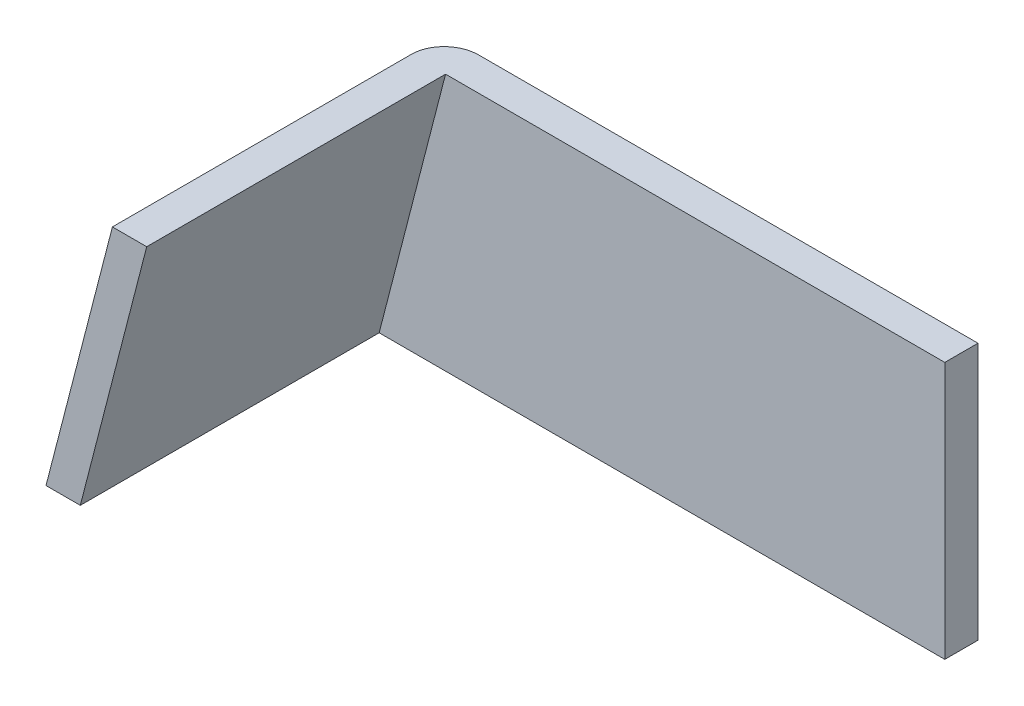
ISO-10303-21;
HEADER;
FILE_DESCRIPTION(('STEP AP214'),'2;1');
FILE_NAME('part.step','',(''),(''),'','','');
FILE_SCHEMA(('AUTOMOTIVE_DESIGN { 1 0 10303 214 1 1 1 1 }'));
ENDSEC;
DATA;
#1=APPLICATION_CONTEXT('core data for automotive mechanical design processes');
#2=APPLICATION_PROTOCOL_DEFINITION('international standard','automotive_design',2000,#1);
#3=PRODUCT_CONTEXT('',#1,'mechanical');
#4=PRODUCT('Part','Part','',(#3));
#5=PRODUCT_RELATED_PRODUCT_CATEGORY('part','',(#4));
#6=PRODUCT_DEFINITION_FORMATION('','',#4);
#7=PRODUCT_DEFINITION_CONTEXT('part definition',#1,'design');
#8=PRODUCT_DEFINITION('design','',#6,#7);
#9=PRODUCT_DEFINITION_SHAPE('','',#8);
#10=(LENGTH_UNIT() NAMED_UNIT(*) SI_UNIT(.MILLI.,.METRE.));
#11=(NAMED_UNIT(*) PLANE_ANGLE_UNIT() SI_UNIT($,.RADIAN.));
#12=(NAMED_UNIT(*) SI_UNIT($,.STERADIAN.) SOLID_ANGLE_UNIT());
#13=UNCERTAINTY_MEASURE_WITH_UNIT(LENGTH_MEASURE(1.E-05),#10,'distance_accuracy_value','');
#14=(GEOMETRIC_REPRESENTATION_CONTEXT(3) GLOBAL_UNCERTAINTY_ASSIGNED_CONTEXT((#13)) GLOBAL_UNIT_ASSIGNED_CONTEXT((#10,
#11,#12)) REPRESENTATION_CONTEXT('',''));
#15=CARTESIAN_POINT('',(0.,0.,0.));
#16=DIRECTION('',(0.,0.,1.));
#17=DIRECTION('',(1.,0.,0.));
#18=AXIS2_PLACEMENT_3D('',#15,#16,#17);
#19=CARTESIAN_POINT('',(-54.0821026600799,-24.5934553307693,-5.08));
#20=DIRECTION('',(0.249998310160621,0.968246272864933,0.));
#21=DIRECTION('',(-0.968246272864933,0.249998310160621,0.));
#22=AXIS2_PLACEMENT_3D('',#19,#20,#21);
#23=PLANE('',#22);
#24=DIRECTION('',(0.,0.,1.));
#25=VECTOR('',#24,1.);
#26=CARTESIAN_POINT('',(-54.0821026600799,-24.5934553307693,-5.08));
#27=LINE('',#26,#25);
#28=CARTESIAN_POINT('',(-54.0821026600799,-24.5934553307693,-3.19280790196288));
#29=VERTEX_POINT('',#28);
#30=CARTESIAN_POINT('',(-54.0821026600798,-24.5934553307693,-3.175));
#31=VERTEX_POINT('',#30);
#32=EDGE_CURVE('E72',#29,#31,#27,.T.);
#33=ORIENTED_EDGE('',*,*,#32,.F.);
#34=CARTESIAN_POINT('',(-54.0648117797553,-24.597919784683,0.));
#35=DIRECTION('',(0.249998310160621,0.968246272864933,0.));
#36=DIRECTION('',(0.701781311894938,-0.18119784913493,-0.688963228150744));
#37=AXIS2_PLACEMENT_3D('',#34,#35,#36);
#38=ELLIPSE('',#37,3.1928587254666,3.19285706304279);
#39=CARTESIAN_POINT('',(-57.156284576426,-23.7997106960093,0.));
#40=VERTEX_POINT('',#39);
#41=EDGE_CURVE('E47',#29,#40,#38,.T.);
#42=ORIENTED_EDGE('',*,*,#41,.T.);
#43=CARTESIAN_POINT('',(-54.0821026600798,-24.5934553307693,0.));
#44=DIRECTION('',(0.249998310160622,0.968246272864933,0.));
#45=DIRECTION('',(-0.968246272864933,0.249998310160622,0.));
#46=AXIS2_PLACEMENT_3D('',#43,#44,#45);
#47=CIRCLE('',#46,3.175);
#48=EDGE_CURVE('E147',#31,#40,#47,.T.);
#49=ORIENTED_EDGE('',*,*,#48,.F.);
#50=EDGE_LOOP('',(#33,#42,#49));
#51=FACE_BOUND('',#50,.T.);
#52=ADVANCED_FACE('F38',(#51),#23,.T.);
#53=CARTESIAN_POINT('',(-47.732145582,0.,-3.175));
#54=DIRECTION('',(0.,1.,0.));
#55=DIRECTION('',(0.,0.,1.));
#56=AXIS2_PLACEMENT_3D('',#53,#54,#55);
#57=PLANE('',#56);
#58=DIRECTION('',(-1.,0.,0.));
#59=VECTOR('',#58,1.);
#60=CARTESIAN_POINT('',(-47.732145582,0.,0.));
#61=LINE('',#60,#59);
#62=CARTESIAN_POINT('',(0.,0.,0.));
#63=VERTEX_POINT('',#62);
#64=CARTESIAN_POINT('',(-47.732145582,0.,0.));
#65=VERTEX_POINT('',#64);
#66=EDGE_CURVE('E160',#63,#65,#61,.T.);
#67=ORIENTED_EDGE('',*,*,#66,.F.);
#68=DIRECTION('',(0.,0.,1.));
#69=VECTOR('',#68,1.);
#70=CARTESIAN_POINT('',(0.,0.,-3.175));
#71=LINE('',#70,#69);
#72=CARTESIAN_POINT('',(0.,0.,-3.175));
#73=VERTEX_POINT('',#72);
#74=EDGE_CURVE('E55',#73,#63,#71,.T.);
#75=ORIENTED_EDGE('',*,*,#74,.F.);
#76=DIRECTION('',(-1.,0.,0.));
#77=VECTOR('',#76,1.);
#78=CARTESIAN_POINT('',(-47.732145582,0.,-3.175));
#79=LINE('',#78,#77);
#80=CARTESIAN_POINT('',(-47.732145582,0.,-3.175));
#81=VERTEX_POINT('',#80);
#82=EDGE_CURVE('E164',#73,#81,#79,.T.);
#83=ORIENTED_EDGE('',*,*,#82,.T.);
#84=CARTESIAN_POINT('',(-47.732145582,0.,0.));
#85=DIRECTION('',(0.,-1.,0.));
#86=DIRECTION('',(1.,0.,0.));
#87=AXIS2_PLACEMENT_3D('',#84,#85,#86);
#88=ELLIPSE('',#87,3.27912442214265,3.175);
#89=CARTESIAN_POINT('',(-51.0112700041428,0.,0.));
#90=VERTEX_POINT('',#89);
#91=EDGE_CURVE('E132',#81,#90,#88,.F.);
#92=ORIENTED_EDGE('',*,*,#91,.T.);
#93=DIRECTION('',(0.,0.,1.));
#94=VECTOR('',#93,1.);
#95=CARTESIAN_POINT('',(-51.0112700041428,0.,-5.588));
#96=LINE('',#95,#94);
#97=CARTESIAN_POINT('',(-51.0112700041428,0.,28.575));
#98=VERTEX_POINT('',#97);
#99=EDGE_CURVE('E125',#90,#98,#96,.T.);
#100=ORIENTED_EDGE('',*,*,#99,.T.);
#101=DIRECTION('',(-1.,0.,0.));
#102=VECTOR('',#101,1.);
#103=CARTESIAN_POINT('',(-50.8063274983463,0.,28.575));
#104=LINE('',#103,#102);
#105=CARTESIAN_POINT('',(-47.7321455820001,0.,28.575));
#106=VERTEX_POINT('',#105);
#107=EDGE_CURVE('E127',#106,#98,#104,.T.);
#108=ORIENTED_EDGE('',*,*,#107,.F.);
#109=DIRECTION('',(0.,0.,-1.));
#110=VECTOR('',#109,1.);
#111=CARTESIAN_POINT('',(-47.732145582,0.,0.));
#112=LINE('',#111,#110);
#113=EDGE_CURVE('E144',#106,#65,#112,.T.);
#114=ORIENTED_EDGE('',*,*,#113,.T.);
#115=EDGE_LOOP('',(#67,#75,#83,#92,#100,#108,#114));
#116=FACE_BOUND('',#115,.T.);
#117=ADVANCED_FACE('F202',(#116),#57,.T.);
#118=CARTESIAN_POINT('',(0.,-24.5934553307693,-3.175));
#119=DIRECTION('',(1.,0.,0.));
#120=DIRECTION('',(0.,0.,-1.));
#121=AXIS2_PLACEMENT_3D('',#118,#119,#120);
#122=PLANE('',#121);
#123=DIRECTION('',(0.,1.,0.));
#124=VECTOR('',#123,1.);
#125=CARTESIAN_POINT('',(0.,-24.5934553307693,0.));
#126=LINE('',#125,#124);
#127=CARTESIAN_POINT('',(0.,-24.5934553307693,0.));
#128=VERTEX_POINT('',#127);
#129=EDGE_CURVE('E170',#128,#63,#126,.T.);
#130=ORIENTED_EDGE('',*,*,#129,.F.);
#131=DIRECTION('',(0.,0.,1.));
#132=VECTOR('',#131,1.);
#133=CARTESIAN_POINT('',(0.,-24.5934553307693,-3.175));
#134=LINE('',#133,#132);
#135=CARTESIAN_POINT('',(0.,-24.5934553307693,-3.175));
#136=VERTEX_POINT('',#135);
#137=EDGE_CURVE('E66',#136,#128,#134,.T.);
#138=ORIENTED_EDGE('',*,*,#137,.F.);
#139=DIRECTION('',(0.,1.,0.));
#140=VECTOR('',#139,1.);
#141=CARTESIAN_POINT('',(0.,-24.5934553307693,-3.175));
#142=LINE('',#141,#140);
#143=EDGE_CURVE('E162',#136,#73,#142,.T.);
#144=ORIENTED_EDGE('',*,*,#143,.T.);
#145=ORIENTED_EDGE('',*,*,#74,.T.);
#146=EDGE_LOOP('',(#130,#138,#144,#145));
#147=FACE_BOUND('',#146,.T.);
#148=ADVANCED_FACE('F191',(#147),#122,.T.);
#149=CARTESIAN_POINT('',(-54.0821026600798,-24.5934553307693,-3.175));
#150=DIRECTION('',(0.,-1.,0.));
#151=DIRECTION('',(1.,0.,0.));
#152=AXIS2_PLACEMENT_3D('',#149,#150,#151);
#153=PLANE('',#152);
#154=DIRECTION('',(-0.999994464513361,0.,-0.00332730260657873));
#155=VECTOR('',#154,1.);
#156=CARTESIAN_POINT('',(-54.0927011661266,-24.5934553307693,0.0102971106335373));
#157=LINE('',#156,#155);
#158=CARTESIAN_POINT('',(-57.360600989923,-24.5934553307693,-0.000576241157511481));
#159=VERTEX_POINT('',#158);
#160=CARTESIAN_POINT('',(-57.3612270822224,-24.5934553307693,-0.000578324367583229));
#161=VERTEX_POINT('',#160);
#162=EDGE_CURVE('E117',#159,#161,#157,.T.);
#163=ORIENTED_EDGE('',*,*,#162,.F.);
#164=CARTESIAN_POINT('',(-54.063662592508,-24.5934553307693,3.24109539653924E-06));
#165=DIRECTION('',(0.,-1.,0.));
#166=DIRECTION('',(-0.999996022873098,0.,-0.00282032586542445));
#167=AXIS2_PLACEMENT_3D('',#164,#165,#166);
#168=ELLIPSE('',#167,3.29693921224174,3.19285706304279);
#169=EDGE_CURVE('E110',#159,#29,#168,.T.);
#170=ORIENTED_EDGE('',*,*,#169,.T.);
#171=ORIENTED_EDGE('',*,*,#32,.T.);
#172=DIRECTION('',(1.,0.,0.));
#173=VECTOR('',#172,1.);
#174=CARTESIAN_POINT('',(-54.0821026600798,-24.5934553307693,-3.175));
#175=LINE('',#174,#173);
#176=EDGE_CURVE('E159',#31,#136,#175,.T.);
#177=ORIENTED_EDGE('',*,*,#176,.T.);
#178=ORIENTED_EDGE('',*,*,#137,.T.);
#179=DIRECTION('',(1.,0.,0.));
#180=VECTOR('',#179,1.);
#181=CARTESIAN_POINT('',(-54.0821026600798,-24.5934553307693,0.));
#182=LINE('',#181,#180);
#183=CARTESIAN_POINT('',(-54.0821026600798,-24.5934553307693,0.));
#184=VERTEX_POINT('',#183);
#185=EDGE_CURVE('E167',#184,#128,#182,.T.);
#186=ORIENTED_EDGE('',*,*,#185,.F.);
#187=DIRECTION('',(0.,0.,1.));
#188=VECTOR('',#187,1.);
#189=CARTESIAN_POINT('',(-54.0821026600799,-24.5934553307693,28.575));
#190=LINE('',#189,#188);
#191=CARTESIAN_POINT('',(-54.0821026600799,-24.5934553307693,28.575));
#192=VERTEX_POINT('',#191);
#193=EDGE_CURVE('E138',#184,#192,#190,.T.);
#194=ORIENTED_EDGE('',*,*,#193,.T.);
#195=DIRECTION('',(1.,0.,0.));
#196=VECTOR('',#195,1.);
#197=CARTESIAN_POINT('',(-57.3612270822225,-24.5934553307693,28.575));
#198=LINE('',#197,#196);
#199=CARTESIAN_POINT('',(-57.3612270822225,-24.5934553307693,28.575));
#200=VERTEX_POINT('',#199);
#201=EDGE_CURVE('E134',#200,#192,#198,.T.);
#202=ORIENTED_EDGE('',*,*,#201,.F.);
#203=DIRECTION('',(0.,0.,1.));
#204=VECTOR('',#203,1.);
#205=CARTESIAN_POINT('',(-57.3612270822225,-24.5934553307693,-5.08));
#206=LINE('',#205,#204);
#207=EDGE_CURVE('E124',#161,#200,#206,.T.);
#208=ORIENTED_EDGE('',*,*,#207,.F.);
#209=EDGE_LOOP('',(#163,#170,#171,#177,#178,#186,#194,#202,#208));
#210=FACE_BOUND('',#209,.T.);
#211=ADVANCED_FACE('F40',(#210),#153,.T.);
#212=CARTESIAN_POINT('',(0.,0.,-3.175));
#213=DIRECTION('',(0.,0.,1.));
#214=DIRECTION('',(1.,0.,0.));
#215=AXIS2_PLACEMENT_3D('',#212,#213,#214);
#216=PLANE('',#215);
#217=DIRECTION('',(-0.249998310160622,-0.968246272864933,0.));
#218=VECTOR('',#217,1.);
#219=CARTESIAN_POINT('',(-47.732145582,0.,-3.175));
#220=LINE('',#219,#218);
#221=EDGE_CURVE('E157',#81,#31,#220,.T.);
#222=ORIENTED_EDGE('',*,*,#221,.F.);
#223=ORIENTED_EDGE('',*,*,#82,.F.);
#224=ORIENTED_EDGE('',*,*,#143,.F.);
#225=ORIENTED_EDGE('',*,*,#176,.F.);
#226=EDGE_LOOP('',(#222,#223,#224,#225));
#227=FACE_BOUND('',#226,.T.);
#228=ADVANCED_FACE('F189',(#227),#216,.F.);
#229=CARTESIAN_POINT('',(0.,0.,0.));
#230=DIRECTION('',(0.,0.,1.));
#231=DIRECTION('',(1.,0.,0.));
#232=AXIS2_PLACEMENT_3D('',#229,#230,#231);
#233=PLANE('',#232);
#234=DIRECTION('',(-0.249998310160622,-0.968246272864933,0.));
#235=VECTOR('',#234,1.);
#236=CARTESIAN_POINT('',(-47.732145582,0.,0.));
#237=LINE('',#236,#235);
#238=EDGE_CURVE('E156',#65,#184,#237,.T.);
#239=ORIENTED_EDGE('',*,*,#238,.T.);
#240=ORIENTED_EDGE('',*,*,#185,.T.);
#241=ORIENTED_EDGE('',*,*,#129,.T.);
#242=ORIENTED_EDGE('',*,*,#66,.T.);
#243=EDGE_LOOP('',(#239,#240,#241,#242));
#244=FACE_BOUND('',#243,.T.);
#245=ADVANCED_FACE('F193',(#244),#233,.T.);
#246=CARTESIAN_POINT('',(-47.732145582,0.,0.));
#247=DIRECTION('',(0.249998310160622,0.968246272864933,0.));
#248=DIRECTION('',(-0.968246272864933,0.249998310160622,0.));
#249=AXIS2_PLACEMENT_3D('',#246,#247,#248);
#250=CYLINDRICAL_SURFACE('',#249,3.175);
#251=ORIENTED_EDGE('',*,*,#91,.F.);
#252=ORIENTED_EDGE('',*,*,#221,.T.);
#253=ORIENTED_EDGE('',*,*,#48,.T.);
#254=DIRECTION('',(-0.249998310160622,-0.968246272864933,0.));
#255=VECTOR('',#254,1.);
#256=CARTESIAN_POINT('',(-50.8063274983462,0.793744634759973,0.));
#257=LINE('',#256,#255);
#258=EDGE_CURVE('E140',#90,#40,#257,.T.);
#259=ORIENTED_EDGE('',*,*,#258,.F.);
#260=EDGE_LOOP('',(#251,#252,#253,#259));
#261=FACE_BOUND('',#260,.T.);
#262=ADVANCED_FACE('F183',(#261),#250,.T.);
#263=CARTESIAN_POINT('',(-50.8063274983463,0.793744634759997,28.575));
#264=DIRECTION('',(0.,0.,-1.));
#265=DIRECTION('',(-1.,0.,0.));
#266=AXIS2_PLACEMENT_3D('',#263,#264,#265);
#267=PLANE('',#266);
#268=DIRECTION('',(0.249998310160622,0.968246272864933,0.));
#269=VECTOR('',#268,1.);
#270=CARTESIAN_POINT('',(-47.7321455820001,0.,28.575));
#271=LINE('',#270,#269);
#272=EDGE_CURVE('E150',#192,#106,#271,.T.);
#273=ORIENTED_EDGE('',*,*,#272,.T.);
#274=ORIENTED_EDGE('',*,*,#107,.T.);
#275=DIRECTION('',(0.249998310160622,0.968246272864933,0.));
#276=VECTOR('',#275,1.);
#277=CARTESIAN_POINT('',(-50.8063274983463,0.793744634759997,28.575));
#278=LINE('',#277,#276);
#279=EDGE_CURVE('E143',#200,#98,#278,.T.);
#280=ORIENTED_EDGE('',*,*,#279,.F.);
#281=ORIENTED_EDGE('',*,*,#201,.T.);
#282=EDGE_LOOP('',(#273,#274,#280,#281));
#283=FACE_BOUND('',#282,.T.);
#284=ADVANCED_FACE('F200',(#283),#267,.F.);
#285=CARTESIAN_POINT('',(-47.8231087291645,12.34778455025,-1.71632419058535E-13));
#286=DIRECTION('',(0.968246272864933,-0.249998310160622,0.));
#287=DIRECTION('',(0.249998310160622,0.968246272864933,0.));
#288=AXIS2_PLACEMENT_3D('',#285,#286,#287);
#289=PLANE('',#288);
#290=ORIENTED_EDGE('',*,*,#258,.T.);
#291=DIRECTION('',(-0.249998247950656,-0.968246031925035,-0.000705466531104993));
#292=VECTOR('',#291,1.);
#293=CARTESIAN_POINT('',(-47.8231133741277,12.3477665602552,0.0263371442250715));
#294=LINE('',#293,#292);
#295=EDGE_CURVE('E11',#40,#161,#294,.T.);
#296=ORIENTED_EDGE('',*,*,#295,.T.);
#297=ORIENTED_EDGE('',*,*,#207,.T.);
#298=ORIENTED_EDGE('',*,*,#279,.T.);
#299=ORIENTED_EDGE('',*,*,#99,.F.);
#300=EDGE_LOOP('',(#290,#296,#297,#298,#299));
#301=FACE_BOUND('',#300,.T.);
#302=ADVANCED_FACE('F181',(#301),#289,.F.);
#303=CARTESIAN_POINT('',(-44.7489268128183,11.5540399154901,-1.60546965807708E-13));
#304=DIRECTION('',(0.968246272864933,-0.249998310160622,0.));
#305=DIRECTION('',(0.249998310160622,0.968246272864933,0.));
#306=AXIS2_PLACEMENT_3D('',#303,#304,#305);
#307=PLANE('',#306);
#308=ORIENTED_EDGE('',*,*,#238,.F.);
#309=ORIENTED_EDGE('',*,*,#113,.F.);
#310=ORIENTED_EDGE('',*,*,#272,.F.);
#311=ORIENTED_EDGE('',*,*,#193,.F.);
#312=EDGE_LOOP('',(#308,#309,#310,#311));
#313=FACE_BOUND('',#312,.T.);
#314=ADVANCED_FACE('F197',(#313),#307,.T.);
#315=CARTESIAN_POINT('',(-48.8625240104219,8.42054923599609,0.0233912004757001));
#316=DIRECTION('',(-0.00332730257824584,0.000130501123474488,0.999994455998137));
#317=DIRECTION('',(0.999994464513361,0.,0.00332730260657873));
#318=AXIS2_PLACEMENT_3D('',#315,#316,#317);
#319=PLANE('',#318);
#320=ORIENTED_EDGE('',*,*,#162,.T.);
#321=ORIENTED_EDGE('',*,*,#295,.F.);
#322=DIRECTION('',(-0.249282040270924,-0.968430673877005,-0.000703059382118249));
#323=VECTOR('',#322,1.);
#324=CARTESIAN_POINT('',(-48.8625240104219,8.42054923599609,0.0233912004757004));
#325=LINE('',#324,#323);
#326=EDGE_CURVE('E113',#40,#159,#325,.T.);
#327=ORIENTED_EDGE('',*,*,#326,.T.);
#328=EDGE_LOOP('',(#320,#321,#327));
#329=FACE_BOUND('',#328,.T.);
#330=ADVANCED_FACE('F120',(#329),#319,.F.);
#331=CARTESIAN_POINT('',(-45.7704625293664,7.62462711518784,0.0233928607641001));
#332=DIRECTION('',(-0.249282040270924,-0.968430673877005,-0.000703059382118249));
#333=DIRECTION('',(0.968430913221101,-0.249282101880068,0.));
#334=AXIS2_PLACEMENT_3D('',#331,#332,#333);
#335=CYLINDRICAL_SURFACE('',#334,3.19285706304279);
#336=ORIENTED_EDGE('',*,*,#326,.F.);
#337=ORIENTED_EDGE('',*,*,#41,.F.);
#338=ORIENTED_EDGE('',*,*,#169,.F.);
#339=EDGE_LOOP('',(#336,#337,#338));
#340=FACE_BOUND('',#339,.T.);
#341=ADVANCED_FACE('F112',(#340),#335,.T.);
#342=CLOSED_SHELL('',(#52,#117,#148,#211,#228,#245,#262,#284,#302,#314,#330,#341));
#343=MANIFOLD_SOLID_BREP('B2',#342);
#344=ADVANCED_BREP_SHAPE_REPRESENTATION('',(#18,#343),#14);
#345=SHAPE_DEFINITION_REPRESENTATION(#9,#344);
ENDSEC;
END-ISO-10303-21;
